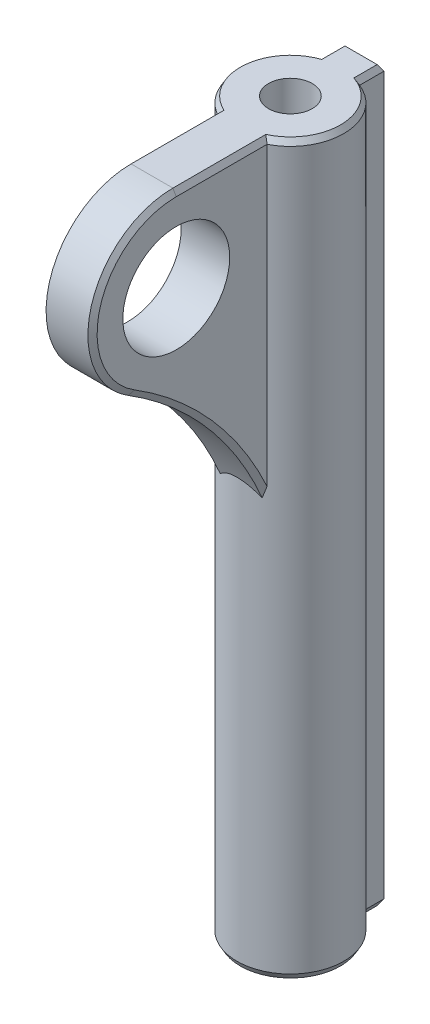
ISO-10303-21;
HEADER;
FILE_DESCRIPTION(('STEP AP214'),'2;1');
FILE_NAME('part.step','',(''),(''),'','','');
FILE_SCHEMA(('AUTOMOTIVE_DESIGN { 1 0 10303 214 1 1 1 1 }'));
ENDSEC;
DATA;
#1=APPLICATION_CONTEXT('core data for automotive mechanical design processes');
#2=APPLICATION_PROTOCOL_DEFINITION('international standard','automotive_design',2000,#1);
#3=PRODUCT_CONTEXT('',#1,'mechanical');
#4=PRODUCT('Part','Part','',(#3));
#5=PRODUCT_RELATED_PRODUCT_CATEGORY('part','',(#4));
#6=PRODUCT_DEFINITION_FORMATION('','',#4);
#7=PRODUCT_DEFINITION_CONTEXT('part definition',#1,'design');
#8=PRODUCT_DEFINITION('design','',#6,#7);
#9=PRODUCT_DEFINITION_SHAPE('','',#8);
#10=(LENGTH_UNIT() NAMED_UNIT(*) SI_UNIT(.MILLI.,.METRE.));
#11=(NAMED_UNIT(*) PLANE_ANGLE_UNIT() SI_UNIT($,.RADIAN.));
#12=(NAMED_UNIT(*) SI_UNIT($,.STERADIAN.) SOLID_ANGLE_UNIT());
#13=UNCERTAINTY_MEASURE_WITH_UNIT(LENGTH_MEASURE(1.E-05),#10,'distance_accuracy_value','');
#14=(GEOMETRIC_REPRESENTATION_CONTEXT(3) GLOBAL_UNCERTAINTY_ASSIGNED_CONTEXT((#13)) GLOBAL_UNIT_ASSIGNED_CONTEXT((#10,
#11,#12)) REPRESENTATION_CONTEXT('',''));
#15=CARTESIAN_POINT('',(0.,0.,0.));
#16=DIRECTION('',(0.,0.,1.));
#17=DIRECTION('',(1.,0.,0.));
#18=AXIS2_PLACEMENT_3D('',#15,#16,#17);
#19=CARTESIAN_POINT('',(0.,-75.,0.));
#20=DIRECTION('',(0.,1.,0.));
#21=DIRECTION('',(0.,0.,1.));
#22=AXIS2_PLACEMENT_3D('',#19,#20,#21);
#23=CYLINDRICAL_SURFACE('',#22,4.5);
#24=CARTESIAN_POINT('',(0.,75.,0.));
#25=DIRECTION('',(0.,1.,0.));
#26=DIRECTION('',(0.,0.,1.));
#27=AXIS2_PLACEMENT_3D('',#24,#25,#26);
#28=CIRCLE('',#27,4.5);
#29=CARTESIAN_POINT('',(0.,75.,4.5));
#30=VERTEX_POINT('',#29);
#31=EDGE_CURVE('E565',#30,#30,#28,.T.);
#32=ORIENTED_EDGE('',*,*,#31,.T.);
#33=EDGE_LOOP('',(#32));
#34=FACE_BOUND('',#33,.T.);
#35=CARTESIAN_POINT('',(0.,-64.,0.));
#36=DIRECTION('',(0.,-1.,0.));
#37=DIRECTION('',(0.,0.,-1.));
#38=AXIS2_PLACEMENT_3D('',#35,#36,#37);
#39=CIRCLE('',#38,4.5);
#40=CARTESIAN_POINT('',(0.,-64.,-4.5));
#41=VERTEX_POINT('',#40);
#42=EDGE_CURVE('E501',#41,#41,#39,.F.);
#43=ORIENTED_EDGE('',*,*,#42,.F.);
#44=EDGE_LOOP('',(#43));
#45=FACE_BOUND('',#44,.T.);
#46=ADVANCED_FACE('F53',(#34,#45),#23,.F.);
#47=CARTESIAN_POINT('',(4.00000000000001,75.,0.));
#48=DIRECTION('',(1.,0.,0.));
#49=DIRECTION('',(0.,0.,-1.));
#50=AXIS2_PLACEMENT_3D('',#47,#48,#49);
#51=PLANE('',#50);
#52=DIRECTION('',(0.,-1.,0.));
#53=VECTOR('',#52,1.);
#54=CARTESIAN_POINT('',(4.,75.,-10.2469507659596));
#55=LINE('',#54,#53);
#56=CARTESIAN_POINT('',(4.,73.7999999999999,-10.2469507659596));
#57=VERTEX_POINT('',#56);
#58=CARTESIAN_POINT('',(4.,-73.8,-10.2469507659596));
#59=VERTEX_POINT('',#58);
#60=EDGE_CURVE('E172',#57,#59,#55,.T.);
#61=ORIENTED_EDGE('',*,*,#60,.T.);
#62=DIRECTION('',(0.,0.,-1.));
#63=VECTOR('',#62,1.);
#64=CARTESIAN_POINT('',(4.,-73.8,-15.2469507659596));
#65=LINE('',#64,#63);
#66=CARTESIAN_POINT('',(4.,-73.8,-15.2469507659596));
#67=VERTEX_POINT('',#66);
#68=EDGE_CURVE('E63',#59,#67,#65,.T.);
#69=ORIENTED_EDGE('',*,*,#68,.T.);
#70=DIRECTION('',(0.,-1.,0.));
#71=VECTOR('',#70,1.);
#72=CARTESIAN_POINT('',(4.,75.,-15.2469507659596));
#73=LINE('',#72,#71);
#74=CARTESIAN_POINT('',(4.,73.7999999999999,-15.2469507659596));
#75=VERTEX_POINT('',#74);
#76=EDGE_CURVE('E432',#75,#67,#73,.T.);
#77=ORIENTED_EDGE('',*,*,#76,.F.);
#78=DIRECTION('',(0.,0.,1.));
#79=VECTOR('',#78,1.);
#80=CARTESIAN_POINT('',(4.00000000000001,73.7999999999999,0.));
#81=LINE('',#80,#79);
#82=EDGE_CURVE('E177',#75,#57,#81,.T.);
#83=ORIENTED_EDGE('',*,*,#82,.T.);
#84=EDGE_LOOP('',(#61,#69,#77,#83));
#85=FACE_BOUND('',#84,.T.);
#86=ADVANCED_FACE('F403',(#85),#51,.T.);
#87=CARTESIAN_POINT('',(0.,75.,-15.2469507659596));
#88=DIRECTION('',(0.,0.,1.));
#89=DIRECTION('',(1.,0.,0.));
#90=AXIS2_PLACEMENT_3D('',#87,#88,#89);
#91=PLANE('',#90);
#92=ORIENTED_EDGE('',*,*,#76,.T.);
#93=DIRECTION('',(-1.,0.,0.));
#94=VECTOR('',#93,1.);
#95=CARTESIAN_POINT('',(0.,-73.8,-15.2469507659596));
#96=LINE('',#95,#94);
#97=CARTESIAN_POINT('',(-4.,-73.8,-15.2469507659596));
#98=VERTEX_POINT('',#97);
#99=EDGE_CURVE('E436',#67,#98,#96,.T.);
#100=ORIENTED_EDGE('',*,*,#99,.T.);
#101=DIRECTION('',(0.,-1.,0.));
#102=VECTOR('',#101,1.);
#103=CARTESIAN_POINT('',(-4.,75.,-15.2469507659596));
#104=LINE('',#103,#102);
#105=CARTESIAN_POINT('',(-4.,73.7999999999999,-15.2469507659596));
#106=VERTEX_POINT('',#105);
#107=EDGE_CURVE('E440',#106,#98,#104,.T.);
#108=ORIENTED_EDGE('',*,*,#107,.F.);
#109=DIRECTION('',(1.,0.,0.));
#110=VECTOR('',#109,1.);
#111=CARTESIAN_POINT('',(4.,73.7999999999999,-15.2469507659596));
#112=LINE('',#111,#110);
#113=EDGE_CURVE('E238',#106,#75,#112,.T.);
#114=ORIENTED_EDGE('',*,*,#113,.T.);
#115=EDGE_LOOP('',(#92,#100,#108,#114));
#116=FACE_BOUND('',#115,.T.);
#117=ADVANCED_FACE('F409',(#116),#91,.F.);
#118=CARTESIAN_POINT('',(-4.,75.,0.));
#119=DIRECTION('',(1.,0.,0.));
#120=DIRECTION('',(0.,0.,-1.));
#121=AXIS2_PLACEMENT_3D('',#118,#119,#120);
#122=PLANE('',#121);
#123=ORIENTED_EDGE('',*,*,#107,.T.);
#124=DIRECTION('',(0.,0.,1.));
#125=VECTOR('',#124,1.);
#126=CARTESIAN_POINT('',(-4.,-73.8,0.));
#127=LINE('',#126,#125);
#128=CARTESIAN_POINT('',(-4.,-73.8,-10.2469507659596));
#129=VERTEX_POINT('',#128);
#130=EDGE_CURVE('E459',#98,#129,#127,.T.);
#131=ORIENTED_EDGE('',*,*,#130,.T.);
#132=DIRECTION('',(0.,-1.,0.));
#133=VECTOR('',#132,1.);
#134=CARTESIAN_POINT('',(-4.,75.,-10.2469507659596));
#135=LINE('',#134,#133);
#136=CARTESIAN_POINT('',(-4.,73.7999999999999,-10.2469507659596));
#137=VERTEX_POINT('',#136);
#138=EDGE_CURVE('E567',#137,#129,#135,.T.);
#139=ORIENTED_EDGE('',*,*,#138,.F.);
#140=DIRECTION('',(0.,0.,-1.));
#141=VECTOR('',#140,1.);
#142=CARTESIAN_POINT('',(-4.,73.7999999999999,-15.2469507659596));
#143=LINE('',#142,#141);
#144=EDGE_CURVE('E240',#137,#106,#143,.T.);
#145=ORIENTED_EDGE('',*,*,#144,.T.);
#146=EDGE_LOOP('',(#123,#131,#139,#145));
#147=FACE_BOUND('',#146,.T.);
#148=ADVANCED_FACE('F423',(#147),#122,.F.);
#149=CARTESIAN_POINT('',(0.,-75.,0.));
#150=DIRECTION('',(0.,1.,0.));
#151=DIRECTION('',(0.,0.,1.));
#152=AXIS2_PLACEMENT_3D('',#149,#150,#151);
#153=PLANE('',#152);
#154=CARTESIAN_POINT('',(0.,-75.,0.));
#155=DIRECTION('',(0.,1.,0.));
#156=DIRECTION('',(0.,0.,1.));
#157=AXIS2_PLACEMENT_3D('',#154,#155,#156);
#158=CIRCLE('',#157,10.3071796769724);
#159=CARTESIAN_POINT('',(3.30717967697245,-75.,-9.76219829124641));
#160=VERTEX_POINT('',#159);
#161=CARTESIAN_POINT('',(-3.30717967697245,-75.,-9.76219829124641));
#162=VERTEX_POINT('',#161);
#163=EDGE_CURVE('E457',#160,#162,#158,.F.);
#164=ORIENTED_EDGE('',*,*,#163,.T.);
#165=DIRECTION('',(0.,0.,-1.));
#166=VECTOR('',#165,1.);
#167=CARTESIAN_POINT('',(-3.30717967697245,-75.,0.));
#168=LINE('',#167,#166);
#169=CARTESIAN_POINT('',(-3.30717967697245,-75.,-14.554130442932));
#170=VERTEX_POINT('',#169);
#171=EDGE_CURVE('E449',#162,#170,#168,.T.);
#172=ORIENTED_EDGE('',*,*,#171,.T.);
#173=DIRECTION('',(1.,0.,0.));
#174=VECTOR('',#173,1.);
#175=CARTESIAN_POINT('',(0.,-75.,-14.554130442932));
#176=LINE('',#175,#174);
#177=CARTESIAN_POINT('',(3.30717967697245,-75.,-14.554130442932));
#178=VERTEX_POINT('',#177);
#179=EDGE_CURVE('E452',#170,#178,#176,.T.);
#180=ORIENTED_EDGE('',*,*,#179,.T.);
#181=DIRECTION('',(0.,0.,1.));
#182=VECTOR('',#181,1.);
#183=CARTESIAN_POINT('',(3.30717967697245,-75.,-10.2469507659596));
#184=LINE('',#183,#182);
#185=EDGE_CURVE('E444',#178,#160,#184,.T.);
#186=ORIENTED_EDGE('',*,*,#185,.T.);
#187=EDGE_LOOP('',(#164,#172,#180,#186));
#188=FACE_BOUND('',#187,.T.);
#189=CARTESIAN_POINT('',(0.,-75.,0.));
#190=DIRECTION('',(0.,-1.,0.));
#191=DIRECTION('',(0.,0.,-1.));
#192=AXIS2_PLACEMENT_3D('',#189,#190,#191);
#193=CIRCLE('',#192,5.2);
#194=CARTESIAN_POINT('',(0.,-75.,-5.2));
#195=VERTEX_POINT('',#194);
#196=EDGE_CURVE('E582',#195,#195,#193,.T.);
#197=ORIENTED_EDGE('',*,*,#196,.F.);
#198=EDGE_LOOP('',(#197));
#199=FACE_BOUND('',#198,.T.);
#200=CARTESIAN_POINT('',(0.,-75.,8.));
#201=DIRECTION('',(0.,-1.,0.));
#202=DIRECTION('',(0.,0.,-1.));
#203=AXIS2_PLACEMENT_3D('',#200,#201,#202);
#204=CIRCLE('',#203,1.3);
#205=CARTESIAN_POINT('',(0.,-75.,6.7));
#206=VERTEX_POINT('',#205);
#207=EDGE_CURVE('E592',#206,#206,#204,.T.);
#208=ORIENTED_EDGE('',*,*,#207,.F.);
#209=EDGE_LOOP('',(#208));
#210=FACE_BOUND('',#209,.T.);
#211=CARTESIAN_POINT('',(8.,-75.,0.));
#212=DIRECTION('',(0.,-1.,0.));
#213=DIRECTION('',(0.,0.,-1.));
#214=AXIS2_PLACEMENT_3D('',#211,#212,#213);
#215=CIRCLE('',#214,1.3);
#216=CARTESIAN_POINT('',(8.,-75.,-1.3));
#217=VERTEX_POINT('',#216);
#218=EDGE_CURVE('E598',#217,#217,#215,.T.);
#219=ORIENTED_EDGE('',*,*,#218,.F.);
#220=EDGE_LOOP('',(#219));
#221=FACE_BOUND('',#220,.T.);
#222=CARTESIAN_POINT('',(0.,-75.,-8.));
#223=DIRECTION('',(0.,-1.,0.));
#224=DIRECTION('',(0.,0.,-1.));
#225=AXIS2_PLACEMENT_3D('',#222,#223,#224);
#226=CIRCLE('',#225,1.3);
#227=CARTESIAN_POINT('',(0.,-75.,-9.3));
#228=VERTEX_POINT('',#227);
#229=EDGE_CURVE('E555',#228,#228,#226,.T.);
#230=ORIENTED_EDGE('',*,*,#229,.F.);
#231=EDGE_LOOP('',(#230));
#232=FACE_BOUND('',#231,.T.);
#233=CARTESIAN_POINT('',(-8.,-75.,0.));
#234=DIRECTION('',(0.,-1.,0.));
#235=DIRECTION('',(0.,0.,-1.));
#236=AXIS2_PLACEMENT_3D('',#233,#234,#235);
#237=CIRCLE('',#236,1.3);
#238=CARTESIAN_POINT('',(-8.,-75.,-1.3));
#239=VERTEX_POINT('',#238);
#240=EDGE_CURVE('E556',#239,#239,#237,.T.);
#241=ORIENTED_EDGE('',*,*,#240,.F.);
#242=EDGE_LOOP('',(#241));
#243=FACE_BOUND('',#242,.T.);
#244=ADVANCED_FACE('F419',(#188,#199,#210,#221,#232,#243),#153,.F.);
#245=CARTESIAN_POINT('',(0.,75.,0.));
#246=DIRECTION('',(0.,1.,0.));
#247=DIRECTION('',(0.,0.,1.));
#248=AXIS2_PLACEMENT_3D('',#245,#246,#247);
#249=PLANE('',#248);
#250=DIRECTION('',(-1.,0.,0.));
#251=VECTOR('',#250,1.);
#252=CARTESIAN_POINT('',(5.,75.,28.5));
#253=LINE('',#252,#251);
#254=CARTESIAN_POINT('',(4.30717967697239,75.,28.5));
#255=VERTEX_POINT('',#254);
#256=CARTESIAN_POINT('',(-4.30717967697239,75.,28.5));
#257=VERTEX_POINT('',#256);
#258=EDGE_CURVE('E483',#255,#257,#253,.T.);
#259=ORIENTED_EDGE('',*,*,#258,.F.);
#260=DIRECTION('',(0.,0.,-1.));
#261=VECTOR('',#260,1.);
#262=CARTESIAN_POINT('',(4.30717967697239,75.,0.));
#263=LINE('',#262,#261);
#264=CARTESIAN_POINT('',(4.30717967697239,75.,9.36408864351831));
#265=VERTEX_POINT('',#264);
#266=EDGE_CURVE('E234',#255,#265,#263,.T.);
#267=ORIENTED_EDGE('',*,*,#266,.T.);
#268=CARTESIAN_POINT('',(0.,75.,0.));
#269=DIRECTION('',(0.,1.,0.));
#270=DIRECTION('',(0.,0.,1.));
#271=AXIS2_PLACEMENT_3D('',#268,#269,#270);
#272=CIRCLE('',#271,10.3071796769724);
#273=CARTESIAN_POINT('',(3.30717967697239,75.,-9.76219829124636));
#274=VERTEX_POINT('',#273);
#275=EDGE_CURVE('E194',#265,#274,#272,.T.);
#276=ORIENTED_EDGE('',*,*,#275,.T.);
#277=DIRECTION('',(0.,0.,-1.));
#278=VECTOR('',#277,1.);
#279=CARTESIAN_POINT('',(3.3071796769724,75.,0.));
#280=LINE('',#279,#278);
#281=CARTESIAN_POINT('',(3.30717967697239,75.,-14.554130442932));
#282=VERTEX_POINT('',#281);
#283=EDGE_CURVE('E231',#274,#282,#280,.T.);
#284=ORIENTED_EDGE('',*,*,#283,.T.);
#285=DIRECTION('',(-1.,0.,0.));
#286=VECTOR('',#285,1.);
#287=CARTESIAN_POINT('',(-4.,75.,-14.554130442932));
#288=LINE('',#287,#286);
#289=CARTESIAN_POINT('',(-3.30717967697239,75.,-14.554130442932));
#290=VERTEX_POINT('',#289);
#291=EDGE_CURVE('E229',#282,#290,#288,.T.);
#292=ORIENTED_EDGE('',*,*,#291,.T.);
#293=DIRECTION('',(0.,0.,1.));
#294=VECTOR('',#293,1.);
#295=CARTESIAN_POINT('',(-3.30717967697239,75.,-10.2469507659596));
#296=LINE('',#295,#294);
#297=CARTESIAN_POINT('',(-3.30717967697239,75.,-9.76219829124637));
#298=VERTEX_POINT('',#297);
#299=EDGE_CURVE('E227',#290,#298,#296,.T.);
#300=ORIENTED_EDGE('',*,*,#299,.T.);
#301=CARTESIAN_POINT('',(0.,75.,0.));
#302=DIRECTION('',(0.,1.,0.));
#303=DIRECTION('',(0.,0.,1.));
#304=AXIS2_PLACEMENT_3D('',#301,#302,#303);
#305=CIRCLE('',#304,10.3071796769724);
#306=CARTESIAN_POINT('',(-4.30717967697239,75.,9.36408864351831));
#307=VERTEX_POINT('',#306);
#308=EDGE_CURVE('E223',#298,#307,#305,.T.);
#309=ORIENTED_EDGE('',*,*,#308,.T.);
#310=DIRECTION('',(0.,0.,1.));
#311=VECTOR('',#310,1.);
#312=CARTESIAN_POINT('',(-4.30717967697239,75.,28.5));
#313=LINE('',#312,#311);
#314=EDGE_CURVE('E225',#307,#257,#313,.T.);
#315=ORIENTED_EDGE('',*,*,#314,.T.);
#316=EDGE_LOOP('',(#259,#267,#276,#284,#292,#300,#309,#315));
#317=FACE_BOUND('',#316,.T.);
#318=ORIENTED_EDGE('',*,*,#31,.F.);
#319=EDGE_LOOP('',(#318));
#320=FACE_BOUND('',#319,.T.);
#321=ADVANCED_FACE('F416',(#317,#320),#249,.T.);
#322=CARTESIAN_POINT('',(0.,75.,0.));
#323=DIRECTION('',(0.,-1.,0.));
#324=DIRECTION('',(0.,0.,-1.));
#325=AXIS2_PLACEMENT_3D('',#322,#323,#324);
#326=CYLINDRICAL_SURFACE('',#325,11.);
#327=ORIENTED_EDGE('',*,*,#138,.T.);
#328=CARTESIAN_POINT('',(0.,-73.8,0.));
#329=DIRECTION('',(0.,1.,0.));
#330=DIRECTION('',(0.,0.,1.));
#331=AXIS2_PLACEMENT_3D('',#328,#329,#330);
#332=CIRCLE('',#331,11.);
#333=EDGE_CURVE('E12',#129,#59,#332,.T.);
#334=ORIENTED_EDGE('',*,*,#333,.T.);
#335=ORIENTED_EDGE('',*,*,#60,.F.);
#336=CARTESIAN_POINT('',(0.,73.7999999999999,0.));
#337=DIRECTION('',(0.,1.,0.));
#338=DIRECTION('',(0.,0.,1.));
#339=AXIS2_PLACEMENT_3D('',#336,#337,#338);
#340=CIRCLE('',#339,11.);
#341=CARTESIAN_POINT('',(5.,73.7999999999999,9.79795897113271));
#342=VERTEX_POINT('',#341);
#343=EDGE_CURVE('E168',#57,#342,#340,.F.);
#344=ORIENTED_EDGE('',*,*,#343,.T.);
#345=DIRECTION('',(0.,-1.,0.));
#346=VECTOR('',#345,1.);
#347=CARTESIAN_POINT('',(5.,75.,9.79795897113271));
#348=LINE('',#347,#346);
#349=CARTESIAN_POINT('',(5.,12.783905391273,9.79795897113271));
#350=VERTEX_POINT('',#349);
#351=EDGE_CURVE('E171',#342,#350,#348,.T.);
#352=ORIENTED_EDGE('',*,*,#351,.T.);
#353=CARTESIAN_POINT('',(5.,12.783905391273,9.79795897113271));
#354=CARTESIAN_POINT('',(4.93930593642414,12.5994630863839,9.82892944244213));
#355=CARTESIAN_POINT('',(4.87937376705051,12.4145886180427,9.85880499231397));
#356=CARTESIAN_POINT('',(4.76100722378545,12.0440758438084,9.91650927441497));
#357=CARTESIAN_POINT('',(4.70257260884592,11.8584376664966,9.94433833741437));
#358=CARTESIAN_POINT('',(4.58715575733198,11.4864388596709,9.9981025082537));
#359=CARTESIAN_POINT('',(4.53017351532743,11.300078232861,10.0240376231754));
#360=CARTESIAN_POINT('',(4.41762188284964,10.926660814369,10.0741453192974));
#361=CARTESIAN_POINT('',(4.3620527227456,10.7396039148025,10.0983176142967));
#362=CARTESIAN_POINT('',(4.30717967697239,10.5522425708362,10.1216699822843));
#363=B_SPLINE_CURVE_WITH_KNOTS('',3,(#353,#354,#355,#356,#357,#358,#359,#360,#361,#362),
.UNSPECIFIED.,.F.,.F.,(4,2,2,2,4),(0.,0.589870659791757,1.179645769277,1.76941867338227,
2.3592871173256),.UNSPECIFIED.);
#364=CARTESIAN_POINT('',(4.30717967697239,10.5522425708362,10.1216699822843));
#365=VERTEX_POINT('',#364);
#366=EDGE_CURVE('E242',#350,#365,#363,.T.);
#367=ORIENTED_EDGE('',*,*,#366,.T.);
#368=CARTESIAN_POINT('',(-5.,9.78129578281709,9.79795897113271));
#369=CARTESIAN_POINT('',(-4.88977114653314,9.9175072341646,9.85419403088753));
#370=CARTESIAN_POINT('',(-4.77605809562833,10.0511824284763,9.90989315751003));
#371=CARTESIAN_POINT('',(-4.54108414471604,10.3126570559207,10.0197546239638));
#372=CARTESIAN_POINT('',(-4.41981539631437,10.4404501312473,10.0739152777786));
#373=CARTESIAN_POINT('',(-4.16740442285191,10.6910282585564,10.1809522650668));
#374=CARTESIAN_POINT('',(-4.03613653041496,10.8137023713564,10.233794815367));
#375=CARTESIAN_POINT('',(-3.76518788335405,11.0505176042248,10.336556114344));
#376=CARTESIAN_POINT('',(-3.62550941375496,11.1646610232328,10.386475649954));
#377=CARTESIAN_POINT('',(-3.19112657023371,11.4937845915818,10.5313870555769));
#378=CARTESIAN_POINT('',(-2.88259175138059,11.6939072144183,10.620865185817));
#379=CARTESIAN_POINT('',(-2.39488797813374,11.9521390877513,10.7374237778581));
#380=CARTESIAN_POINT('',(-2.22863345759289,12.0310733268458,10.7732631768991));
#381=CARTESIAN_POINT('',(-1.88831461387756,12.1732899342777,10.8380935267829));
#382=CARTESIAN_POINT('',(-1.71425417022238,12.2365799780799,10.8670878356969));
#383=CARTESIAN_POINT('',(-1.28327386678282,12.3689017437005,10.927879474447));
#384=CARTESIAN_POINT('',(-1.02283416612037,12.4287540952114,10.9555456190938));
#385=CARTESIAN_POINT('',(-0.494413163601502,12.5076805792695,10.9920729425141));
#386=CARTESIAN_POINT('',(-0.226430338737533,12.5267464160349,11.0009302956667));
#387=CARTESIAN_POINT('',(0.309368520549645,12.5223985689452,10.9989133687759));
#388=CARTESIAN_POINT('',(0.577184193289425,12.4989469991516,10.9880214908059));
#389=CARTESIAN_POINT('',(1.1044367377381,12.4115915150439,10.9476150623476));
#390=CARTESIAN_POINT('',(1.36387501496945,12.3476944239537,10.9181036530067));
#391=CARTESIAN_POINT('',(1.9290689124069,12.1647553393415,10.8341429771761));
#392=CARTESIAN_POINT('',(2.23107446426361,12.0361834090556,10.7754192088337));
#393=CARTESIAN_POINT('',(2.80918324174526,11.7351553948889,10.6394309751355));
#394=CARTESIAN_POINT('',(3.08514565944953,11.5624775966003,10.5620729530989));
#395=CARTESIAN_POINT('',(3.50497366687084,11.2591915348956,10.4279765075665));
#396=CARTESIAN_POINT('',(3.65788312183305,11.1389926907144,10.3751995405287));
#397=CARTESIAN_POINT('',(3.95385979432944,10.8883398055519,10.266054534254));
#398=CARTESIAN_POINT('',(4.09692141975187,10.7578800265038,10.2096844891029));
#399=CARTESIAN_POINT('',(4.37166967662744,10.490229419162,10.0950678604626));
#400=CARTESIAN_POINT('',(4.50348356123695,10.3531529141534,10.0368567769095));
#401=CARTESIAN_POINT('',(4.75820916594745,10.072120236774,9.91861987093207));
#402=CARTESIAN_POINT('',(4.88113458997532,9.92817524852876,9.85859705347558));
#403=CARTESIAN_POINT('',(5.,9.78129578281709,9.79795897113271));
#404=B_SPLINE_CURVE_WITH_KNOTS('',3,(#368,#369,#370,#371,#372,#373,#374,#375,#376,#377,#378,
#379,#380,#381,#382,#383,#384,#385,#386,#387,#388,#389,#390,#391,#392,#393,#394,#395,#396,#397,
#398,#399,#400,#401,#402,#403),.UNSPECIFIED.,.F.,.F.,(4,2,2,2,2,2,2,2,2,2,2,2,2,2,2,2,2,4),(0.,
0.552095816601055,1.10477499928596,1.66618102295876,2.22743520345877,3.3567001686732,
3.91842319758454,4.47987008053151,5.28211508661467,6.08452324998375,6.8876467657559,
7.69063482940796,8.68554261586962,9.6855536321618,10.2896626025659,10.8941118349895,
11.4904200027953,12.0857882827057),.UNSPECIFIED.);
#405=CARTESIAN_POINT('',(-4.30717967697242,10.5522425708362,10.1216699822843));
#406=VERTEX_POINT('',#405);
#407=EDGE_CURVE('E188',#406,#365,#404,.T.);
#408=ORIENTED_EDGE('',*,*,#407,.F.);
#409=CARTESIAN_POINT('',(-4.30717967697239,10.5522425708362,10.1216699822843));
#410=CARTESIAN_POINT('',(-4.3620527227456,10.7396039148025,10.0983176142967));
#411=CARTESIAN_POINT('',(-4.41762188284965,10.926660814369,10.0741453192974));
#412=CARTESIAN_POINT('',(-4.53017351532744,11.300078232861,10.0240376231754));
#413=CARTESIAN_POINT('',(-4.58715575733199,11.4864388596709,9.99810250825369));
#414=CARTESIAN_POINT('',(-4.70257260884592,11.8584376664966,9.94433833741437));
#415=CARTESIAN_POINT('',(-4.76100722378545,12.0440758438085,9.91650927441497));
#416=CARTESIAN_POINT('',(-4.8793737670505,12.4145886180427,9.85880499231397));
#417=CARTESIAN_POINT('',(-4.93930593642413,12.5994630863839,9.82892944244214));
#418=CARTESIAN_POINT('',(-5.,12.783905391273,9.79795897113271));
#419=B_SPLINE_CURVE_WITH_KNOTS('',3,(#409,#410,#411,#412,#413,#414,#415,#416,#417,#418),
.UNSPECIFIED.,.F.,.F.,(4,2,2,2,4),(0.,0.589868443943343,1.17964134804862,1.76941645753387,
2.35928711732564),.UNSPECIFIED.);
#420=CARTESIAN_POINT('',(-5.,12.783905391273,9.79795897113271));
#421=VERTEX_POINT('',#420);
#422=EDGE_CURVE('E250',#406,#421,#419,.T.);
#423=ORIENTED_EDGE('',*,*,#422,.T.);
#424=DIRECTION('',(0.,-1.,0.));
#425=VECTOR('',#424,1.);
#426=CARTESIAN_POINT('',(-5.,75.,9.79795897113271));
#427=LINE('',#426,#425);
#428=CARTESIAN_POINT('',(-5.,73.7999999999999,9.79795897113271));
#429=VERTEX_POINT('',#428);
#430=EDGE_CURVE('E495',#429,#421,#427,.T.);
#431=ORIENTED_EDGE('',*,*,#430,.F.);
#432=CARTESIAN_POINT('',(0.,73.7999999999999,0.));
#433=DIRECTION('',(0.,1.,0.));
#434=DIRECTION('',(0.,0.,1.));
#435=AXIS2_PLACEMENT_3D('',#432,#433,#434);
#436=CIRCLE('',#435,11.);
#437=EDGE_CURVE('E178',#429,#137,#436,.F.);
#438=ORIENTED_EDGE('',*,*,#437,.T.);
#439=EDGE_LOOP('',(#327,#334,#335,#344,#352,#367,#408,#423,#431,#438));
#440=FACE_BOUND('',#439,.T.);
#441=ADVANCED_FACE('F170',(#440),#326,.T.);
#442=CARTESIAN_POINT('',(-8.,-39.,0.));
#443=DIRECTION('',(0.,-1.,0.));
#444=DIRECTION('',(0.,0.,-1.));
#445=AXIS2_PLACEMENT_3D('',#442,#443,#444);
#446=CYLINDRICAL_SURFACE('',#445,1.3);
#447=CARTESIAN_POINT('',(-8.,-39.,0.));
#448=DIRECTION('',(0.,-1.,0.));
#449=DIRECTION('',(0.,0.,-1.));
#450=AXIS2_PLACEMENT_3D('',#447,#448,#449);
#451=CIRCLE('',#450,1.3);
#452=CARTESIAN_POINT('',(-8.,-39.,-1.3));
#453=VERTEX_POINT('',#452);
#454=EDGE_CURVE('E554',#453,#453,#451,.T.);
#455=ORIENTED_EDGE('',*,*,#454,.F.);
#456=EDGE_LOOP('',(#455));
#457=FACE_BOUND('',#456,.T.);
#458=ORIENTED_EDGE('',*,*,#240,.T.);
#459=EDGE_LOOP('',(#458));
#460=FACE_BOUND('',#459,.T.);
#461=ADVANCED_FACE('F414',(#457,#460),#446,.F.);
#462=CARTESIAN_POINT('',(-8.,-39.,0.));
#463=DIRECTION('',(0.,-1.,0.));
#464=DIRECTION('',(0.,0.,-1.));
#465=AXIS2_PLACEMENT_3D('',#462,#463,#464);
#466=PLANE('',#465);
#467=ORIENTED_EDGE('',*,*,#454,.T.);
#468=EDGE_LOOP('',(#467));
#469=FACE_BOUND('',#468,.T.);
#470=ADVANCED_FACE('F544',(#469),#466,.T.);
#471=CARTESIAN_POINT('',(0.,-39.,-8.));
#472=DIRECTION('',(0.,-1.,0.));
#473=DIRECTION('',(0.,0.,-1.));
#474=AXIS2_PLACEMENT_3D('',#471,#472,#473);
#475=CYLINDRICAL_SURFACE('',#474,1.3);
#476=CARTESIAN_POINT('',(0.,-39.,-8.));
#477=DIRECTION('',(0.,-1.,0.));
#478=DIRECTION('',(0.,0.,-1.));
#479=AXIS2_PLACEMENT_3D('',#476,#477,#478);
#480=CIRCLE('',#479,1.3);
#481=CARTESIAN_POINT('',(0.,-39.,-9.3));
#482=VERTEX_POINT('',#481);
#483=EDGE_CURVE('E559',#482,#482,#480,.T.);
#484=ORIENTED_EDGE('',*,*,#483,.F.);
#485=EDGE_LOOP('',(#484));
#486=FACE_BOUND('',#485,.T.);
#487=ORIENTED_EDGE('',*,*,#229,.T.);
#488=EDGE_LOOP('',(#487));
#489=FACE_BOUND('',#488,.T.);
#490=ADVANCED_FACE('F541',(#486,#489),#475,.F.);
#491=CARTESIAN_POINT('',(0.,-39.,-8.));
#492=DIRECTION('',(0.,-1.,0.));
#493=DIRECTION('',(0.,0.,-1.));
#494=AXIS2_PLACEMENT_3D('',#491,#492,#493);
#495=PLANE('',#494);
#496=ORIENTED_EDGE('',*,*,#483,.T.);
#497=EDGE_LOOP('',(#496));
#498=FACE_BOUND('',#497,.T.);
#499=ADVANCED_FACE('F537',(#498),#495,.T.);
#500=CARTESIAN_POINT('',(8.,-39.,0.));
#501=DIRECTION('',(0.,-1.,0.));
#502=DIRECTION('',(0.,0.,-1.));
#503=AXIS2_PLACEMENT_3D('',#500,#501,#502);
#504=CYLINDRICAL_SURFACE('',#503,1.3);
#505=CARTESIAN_POINT('',(8.,-39.,0.));
#506=DIRECTION('',(0.,-1.,0.));
#507=DIRECTION('',(0.,0.,-1.));
#508=AXIS2_PLACEMENT_3D('',#505,#506,#507);
#509=CIRCLE('',#508,1.3);
#510=CARTESIAN_POINT('',(8.,-39.,-1.3));
#511=VERTEX_POINT('',#510);
#512=EDGE_CURVE('E595',#511,#511,#509,.T.);
#513=ORIENTED_EDGE('',*,*,#512,.F.);
#514=EDGE_LOOP('',(#513));
#515=FACE_BOUND('',#514,.T.);
#516=ORIENTED_EDGE('',*,*,#218,.T.);
#517=EDGE_LOOP('',(#516));
#518=FACE_BOUND('',#517,.T.);
#519=ADVANCED_FACE('F533',(#515,#518),#504,.F.);
#520=CARTESIAN_POINT('',(8.,-39.,0.));
#521=DIRECTION('',(0.,-1.,0.));
#522=DIRECTION('',(0.,0.,-1.));
#523=AXIS2_PLACEMENT_3D('',#520,#521,#522);
#524=PLANE('',#523);
#525=ORIENTED_EDGE('',*,*,#512,.T.);
#526=EDGE_LOOP('',(#525));
#527=FACE_BOUND('',#526,.T.);
#528=ADVANCED_FACE('F529',(#527),#524,.T.);
#529=CARTESIAN_POINT('',(0.,-39.,8.));
#530=DIRECTION('',(0.,-1.,0.));
#531=DIRECTION('',(0.,0.,-1.));
#532=AXIS2_PLACEMENT_3D('',#529,#530,#531);
#533=CYLINDRICAL_SURFACE('',#532,1.3);
#534=CARTESIAN_POINT('',(0.,-39.,8.));
#535=DIRECTION('',(0.,-1.,0.));
#536=DIRECTION('',(0.,0.,-1.));
#537=AXIS2_PLACEMENT_3D('',#534,#535,#536);
#538=CIRCLE('',#537,1.3);
#539=CARTESIAN_POINT('',(0.,-39.,6.7));
#540=VERTEX_POINT('',#539);
#541=EDGE_CURVE('E568',#540,#540,#538,.T.);
#542=ORIENTED_EDGE('',*,*,#541,.F.);
#543=EDGE_LOOP('',(#542));
#544=FACE_BOUND('',#543,.T.);
#545=ORIENTED_EDGE('',*,*,#207,.T.);
#546=EDGE_LOOP('',(#545));
#547=FACE_BOUND('',#546,.T.);
#548=ADVANCED_FACE('F525',(#544,#547),#533,.F.);
#549=CARTESIAN_POINT('',(0.,-39.,8.));
#550=DIRECTION('',(0.,-1.,0.));
#551=DIRECTION('',(0.,0.,-1.));
#552=AXIS2_PLACEMENT_3D('',#549,#550,#551);
#553=PLANE('',#552);
#554=ORIENTED_EDGE('',*,*,#541,.T.);
#555=EDGE_LOOP('',(#554));
#556=FACE_BOUND('',#555,.T.);
#557=ADVANCED_FACE('F518',(#556),#553,.T.);
#558=CARTESIAN_POINT('',(0.,-64.,0.));
#559=DIRECTION('',(0.,-1.,0.));
#560=DIRECTION('',(0.,0.,-1.));
#561=AXIS2_PLACEMENT_3D('',#558,#559,#560);
#562=PLANE('',#561);
#563=CARTESIAN_POINT('',(0.,-64.,0.));
#564=DIRECTION('',(0.,-1.,0.));
#565=DIRECTION('',(0.,0.,-1.));
#566=AXIS2_PLACEMENT_3D('',#563,#564,#565);
#567=CIRCLE('',#566,5.2);
#568=CARTESIAN_POINT('',(0.,-64.,-5.2));
#569=VERTEX_POINT('',#568);
#570=EDGE_CURVE('E585',#569,#569,#567,.T.);
#571=ORIENTED_EDGE('',*,*,#570,.T.);
#572=EDGE_LOOP('',(#571));
#573=FACE_BOUND('',#572,.T.);
#574=ORIENTED_EDGE('',*,*,#42,.T.);
#575=EDGE_LOOP('',(#574));
#576=FACE_BOUND('',#575,.T.);
#577=ADVANCED_FACE('F515',(#573,#576),#562,.T.);
#578=CARTESIAN_POINT('',(0.,-64.,0.));
#579=DIRECTION('',(0.,-1.,0.));
#580=DIRECTION('',(0.,0.,-1.));
#581=AXIS2_PLACEMENT_3D('',#578,#579,#580);
#582=CYLINDRICAL_SURFACE('',#581,5.2);
#583=ORIENTED_EDGE('',*,*,#570,.F.);
#584=EDGE_LOOP('',(#583));
#585=FACE_BOUND('',#584,.T.);
#586=ORIENTED_EDGE('',*,*,#196,.T.);
#587=EDGE_LOOP('',(#586));
#588=FACE_BOUND('',#587,.T.);
#589=ADVANCED_FACE('F511',(#585,#588),#582,.F.);
#590=CARTESIAN_POINT('',(5.,-16.9328556485642,74.5));
#591=DIRECTION('',(-1.,0.,0.));
#592=DIRECTION('',(0.,0.,1.));
#593=AXIS2_PLACEMENT_3D('',#590,#591,#592);
#594=CYLINDRICAL_SURFACE('',#593,70.);
#595=ORIENTED_EDGE('',*,*,#407,.T.);
#596=CARTESIAN_POINT('',(4.30717967697239,-16.9328556485642,74.5));
#597=DIRECTION('',(1.,0.,0.));
#598=DIRECTION('',(0.,0.,-1.));
#599=AXIS2_PLACEMENT_3D('',#596,#597,#598);
#600=CIRCLE('',#599,70.);
#601=CARTESIAN_POINT('',(4.30717967697239,42.6134288702872,37.7));
#602=VERTEX_POINT('',#601);
#603=EDGE_CURVE('E211',#365,#602,#600,.T.);
#604=ORIENTED_EDGE('',*,*,#603,.T.);
#605=DIRECTION('',(-1.,0.,0.));
#606=VECTOR('',#605,1.);
#607=CARTESIAN_POINT('',(5.,42.6134288702872,37.7));
#608=LINE('',#607,#606);
#609=CARTESIAN_POINT('',(-4.30717967697239,42.6134288702872,37.7));
#610=VERTEX_POINT('',#609);
#611=EDGE_CURVE('E480',#602,#610,#608,.T.);
#612=ORIENTED_EDGE('',*,*,#611,.T.);
#613=CARTESIAN_POINT('',(-4.30717967697239,-16.9328556485642,74.5));
#614=DIRECTION('',(1.,0.,0.));
#615=DIRECTION('',(0.,0.,-1.));
#616=AXIS2_PLACEMENT_3D('',#613,#614,#615);
#617=CIRCLE('',#616,70.);
#618=EDGE_CURVE('E209',#610,#406,#617,.F.);
#619=ORIENTED_EDGE('',*,*,#618,.T.);
#620=EDGE_LOOP('',(#595,#604,#612,#619));
#621=FACE_BOUND('',#620,.T.);
#622=ADVANCED_FACE('F487',(#621),#594,.F.);
#623=CARTESIAN_POINT('',(5.,0.,0.));
#624=DIRECTION('',(1.,0.,0.));
#625=DIRECTION('',(0.,0.,-1.));
#626=AXIS2_PLACEMENT_3D('',#623,#624,#625);
#627=PLANE('',#626);
#628=CARTESIAN_POINT('',(5.,57.5,28.5));
#629=DIRECTION('',(1.,0.,0.));
#630=DIRECTION('',(0.,0.,-1.));
#631=AXIS2_PLACEMENT_3D('',#628,#629,#630);
#632=CIRCLE('',#631,11.);
#633=CARTESIAN_POINT('',(5.,57.5,17.5));
#634=VERTEX_POINT('',#633);
#635=EDGE_CURVE('E468',#634,#634,#632,.T.);
#636=ORIENTED_EDGE('',*,*,#635,.F.);
#637=EDGE_LOOP('',(#636));
#638=FACE_BOUND('',#637,.T.);
#639=CARTESIAN_POINT('',(5.,57.5,28.5));
#640=DIRECTION('',(1.,0.,0.));
#641=DIRECTION('',(0.,0.,-1.));
#642=AXIS2_PLACEMENT_3D('',#639,#640,#641);
#643=CIRCLE('',#642,16.2999999999999);
#644=CARTESIAN_POINT('',(5.,73.7999999999999,28.5));
#645=VERTEX_POINT('',#644);
#646=CARTESIAN_POINT('',(5.,43.6342223191818,37.0691428571428));
#647=VERTEX_POINT('',#646);
#648=EDGE_CURVE('E203',#645,#647,#643,.T.);
#649=ORIENTED_EDGE('',*,*,#648,.T.);
#650=CARTESIAN_POINT('',(5.,-16.9328556485642,74.5));
#651=DIRECTION('',(1.,0.,0.));
#652=DIRECTION('',(0.,0.,-1.));
#653=AXIS2_PLACEMENT_3D('',#650,#651,#652);
#654=CIRCLE('',#653,71.2000000000001);
#655=EDGE_CURVE('E187',#647,#350,#654,.F.);
#656=ORIENTED_EDGE('',*,*,#655,.T.);
#657=ORIENTED_EDGE('',*,*,#351,.F.);
#658=DIRECTION('',(0.,0.,1.));
#659=VECTOR('',#658,1.);
#660=CARTESIAN_POINT('',(5.,73.7999999999999,0.));
#661=LINE('',#660,#659);
#662=EDGE_CURVE('E184',#342,#645,#661,.T.);
#663=ORIENTED_EDGE('',*,*,#662,.T.);
#664=EDGE_LOOP('',(#649,#656,#657,#663));
#665=FACE_BOUND('',#664,.T.);
#666=ADVANCED_FACE('F182',(#638,#665),#627,.T.);
#667=CARTESIAN_POINT('',(-5.,0.,0.));
#668=DIRECTION('',(1.,0.,0.));
#669=DIRECTION('',(0.,0.,-1.));
#670=AXIS2_PLACEMENT_3D('',#667,#668,#669);
#671=PLANE('',#670);
#672=CARTESIAN_POINT('',(-5.,57.5,28.5));
#673=DIRECTION('',(1.,0.,0.));
#674=DIRECTION('',(0.,0.,-1.));
#675=AXIS2_PLACEMENT_3D('',#672,#673,#674);
#676=CIRCLE('',#675,11.);
#677=CARTESIAN_POINT('',(-5.,57.5,17.5));
#678=VERTEX_POINT('',#677);
#679=EDGE_CURVE('E463',#678,#678,#676,.T.);
#680=ORIENTED_EDGE('',*,*,#679,.T.);
#681=EDGE_LOOP('',(#680));
#682=FACE_BOUND('',#681,.T.);
#683=ORIENTED_EDGE('',*,*,#430,.T.);
#684=CARTESIAN_POINT('',(-5.,-16.9328556485642,74.5));
#685=DIRECTION('',(1.,0.,0.));
#686=DIRECTION('',(0.,0.,-1.));
#687=AXIS2_PLACEMENT_3D('',#684,#685,#686);
#688=CIRCLE('',#687,71.2000000000001);
#689=CARTESIAN_POINT('',(-5.,43.6342223191818,37.0691428571428));
#690=VERTEX_POINT('',#689);
#691=EDGE_CURVE('E217',#421,#690,#688,.T.);
#692=ORIENTED_EDGE('',*,*,#691,.T.);
#693=CARTESIAN_POINT('',(-5.,57.5,28.5));
#694=DIRECTION('',(1.,0.,0.));
#695=DIRECTION('',(0.,0.,-1.));
#696=AXIS2_PLACEMENT_3D('',#693,#694,#695);
#697=CIRCLE('',#696,16.2999999999999);
#698=CARTESIAN_POINT('',(-5.,73.7999999999999,28.5));
#699=VERTEX_POINT('',#698);
#700=EDGE_CURVE('E215',#690,#699,#697,.F.);
#701=ORIENTED_EDGE('',*,*,#700,.T.);
#702=DIRECTION('',(0.,0.,-1.));
#703=VECTOR('',#702,1.);
#704=CARTESIAN_POINT('',(-5.,73.7999999999999,9.79795897113271));
#705=LINE('',#704,#703);
#706=EDGE_CURVE('E213',#699,#429,#705,.T.);
#707=ORIENTED_EDGE('',*,*,#706,.T.);
#708=EDGE_LOOP('',(#683,#692,#701,#707));
#709=FACE_BOUND('',#708,.T.);
#710=ADVANCED_FACE('F497',(#682,#709),#671,.F.);
#711=CARTESIAN_POINT('',(5.,57.5,28.5));
#712=DIRECTION('',(-1.,0.,0.));
#713=DIRECTION('',(0.,0.,1.));
#714=AXIS2_PLACEMENT_3D('',#711,#712,#713);
#715=CYLINDRICAL_SURFACE('',#714,17.5);
#716=ORIENTED_EDGE('',*,*,#611,.F.);
#717=CARTESIAN_POINT('',(4.30717967697239,57.5,28.5));
#718=DIRECTION('',(1.,0.,0.));
#719=DIRECTION('',(0.,0.,-1.));
#720=AXIS2_PLACEMENT_3D('',#717,#718,#719);
#721=CIRCLE('',#720,17.5);
#722=EDGE_CURVE('E221',#602,#255,#721,.F.);
#723=ORIENTED_EDGE('',*,*,#722,.T.);
#724=ORIENTED_EDGE('',*,*,#258,.T.);
#725=CARTESIAN_POINT('',(-4.30717967697239,57.5,28.5));
#726=DIRECTION('',(1.,0.,0.));
#727=DIRECTION('',(0.,0.,-1.));
#728=AXIS2_PLACEMENT_3D('',#725,#726,#727);
#729=CIRCLE('',#728,17.5);
#730=EDGE_CURVE('E219',#257,#610,#729,.T.);
#731=ORIENTED_EDGE('',*,*,#730,.T.);
#732=EDGE_LOOP('',(#716,#723,#724,#731));
#733=FACE_BOUND('',#732,.T.);
#734=ADVANCED_FACE('F479',(#733),#715,.T.);
#735=CARTESIAN_POINT('',(5.,57.5,28.5));
#736=DIRECTION('',(-1.,0.,0.));
#737=DIRECTION('',(0.,0.,1.));
#738=AXIS2_PLACEMENT_3D('',#735,#736,#737);
#739=CYLINDRICAL_SURFACE('',#738,11.);
#740=ORIENTED_EDGE('',*,*,#635,.T.);
#741=EDGE_LOOP('',(#740));
#742=FACE_BOUND('',#741,.T.);
#743=ORIENTED_EDGE('',*,*,#679,.F.);
#744=EDGE_LOOP('',(#743));
#745=FACE_BOUND('',#744,.T.);
#746=ADVANCED_FACE('F363',(#742,#745),#739,.F.);
#747=CARTESIAN_POINT('',(-4.30717967697239,-16.9328556485642,74.5));
#748=DIRECTION('',(-1.,0.,0.));
#749=DIRECTION('',(0.,0.,1.));
#750=AXIS2_PLACEMENT_3D('',#747,#748,#749);
#751=CONICAL_SURFACE('',#750,70.,1.0471975511966);
#752=ORIENTED_EDGE('',*,*,#422,.F.);
#753=ORIENTED_EDGE('',*,*,#618,.F.);
#754=DIRECTION('',(0.5,-0.736694215632877,0.455281926560962));
#755=VECTOR('',#754,1.);
#756=CARTESIAN_POINT('',(-5.,43.6342223191818,37.0691428571428));
#757=LINE('',#756,#755);
#758=EDGE_CURVE('E461',#690,#610,#757,.T.);
#759=ORIENTED_EDGE('',*,*,#758,.F.);
#760=ORIENTED_EDGE('',*,*,#691,.F.);
#761=EDGE_LOOP('',(#752,#753,#759,#760));
#762=FACE_BOUND('',#761,.T.);
#763=ADVANCED_FACE('F356',(#762),#751,.F.);
#764=CARTESIAN_POINT('',(-4.30717967697239,57.5,28.5));
#765=DIRECTION('',(1.,0.,0.));
#766=DIRECTION('',(0.,0.,-1.));
#767=AXIS2_PLACEMENT_3D('',#764,#765,#766);
#768=CONICAL_SURFACE('',#767,17.5,1.0471975511966);
#769=ORIENTED_EDGE('',*,*,#758,.T.);
#770=ORIENTED_EDGE('',*,*,#730,.F.);
#771=DIRECTION('',(0.5,0.866025403784439,0.));
#772=VECTOR('',#771,1.);
#773=CARTESIAN_POINT('',(-5.,73.7999999999999,28.5));
#774=LINE('',#773,#772);
#775=EDGE_CURVE('E340',#699,#257,#774,.T.);
#776=ORIENTED_EDGE('',*,*,#775,.F.);
#777=ORIENTED_EDGE('',*,*,#700,.F.);
#778=EDGE_LOOP('',(#769,#770,#776,#777));
#779=FACE_BOUND('',#778,.T.);
#780=ADVANCED_FACE('F350',(#779),#768,.T.);
#781=CARTESIAN_POINT('',(-5.,73.7999999999999,0.));
#782=DIRECTION('',(-0.866025403784439,0.5,0.));
#783=DIRECTION('',(0.,0.,1.));
#784=AXIS2_PLACEMENT_3D('',#781,#782,#783);
#785=PLANE('',#784);
#786=ORIENTED_EDGE('',*,*,#775,.T.);
#787=ORIENTED_EDGE('',*,*,#314,.F.);
#788=CARTESIAN_POINT('',(-5.,73.7999999999999,9.79795897113271));
#789=CARTESIAN_POINT('',(-4.88429656413032,74.0004042295365,9.72713821686121));
#790=CARTESIAN_POINT('',(-4.76870983880304,74.2006063104838,9.65557199159659));
#791=CARTESIAN_POINT('',(-4.53776973096896,74.6006063107579,9.51094855006901));
#792=CARTESIAN_POINT('',(-4.42241634862037,74.8004042298106,9.43789133279551));
#793=CARTESIAN_POINT('',(-4.30717967697239,75.,9.36408864351834));
#794=B_SPLINE_CURVE_WITH_KNOTS('',3,(#788,#789,#790,#791,#792,#793),.UNSPECIFIED.,.F.,.F.,(4,2,
4),(0.,0.725993112898074,1.45198671786655),.UNSPECIFIED.);
#795=EDGE_CURVE('E332',#429,#307,#794,.T.);
#796=ORIENTED_EDGE('',*,*,#795,.F.);
#797=ORIENTED_EDGE('',*,*,#706,.F.);
#798=EDGE_LOOP('',(#786,#787,#796,#797));
#799=FACE_BOUND('',#798,.T.);
#800=ADVANCED_FACE('F343',(#799),#785,.T.);
#801=CARTESIAN_POINT('',(0.,75.,0.));
#802=DIRECTION('',(0.,-1.,0.));
#803=DIRECTION('',(0.,0.,-1.));
#804=AXIS2_PLACEMENT_3D('',#801,#802,#803);
#805=CONICAL_SURFACE('',#804,10.3071796769724,0.523598775598298);
#806=ORIENTED_EDGE('',*,*,#795,.T.);
#807=ORIENTED_EDGE('',*,*,#308,.F.);
#808=CARTESIAN_POINT('',(-3.30717967697239,75.,-9.76219829124637));
#809=CARTESIAN_POINT('',(-3.42234477984907,74.8005281905587,-9.84473408789501));
#810=CARTESIAN_POINT('',(-3.53766238503991,74.600792239361,-9.92639804410005));
#811=CARTESIAN_POINT('',(-3.76860249299855,74.2007922388712,-10.0879822007213));
#812=CARTESIAN_POINT('',(-3.88422499548358,74.0005281900688,-10.167902402754));
#813=CARTESIAN_POINT('',(-4.,73.7999999999999,-10.2469507659596));
#814=B_SPLINE_CURVE_WITH_KNOTS('',3,(#808,#809,#810,#811,#812,#813),.UNSPECIFIED.,.F.,.F.,(4,2,
4),(0.,0.73399892240911,1.4679971643341),.UNSPECIFIED.);
#815=EDGE_CURVE('E325',#137,#298,#814,.F.);
#816=ORIENTED_EDGE('',*,*,#815,.F.);
#817=ORIENTED_EDGE('',*,*,#437,.F.);
#818=EDGE_LOOP('',(#806,#807,#816,#817));
#819=FACE_BOUND('',#818,.T.);
#820=ADVANCED_FACE('F320',(#819),#805,.T.);
#821=CARTESIAN_POINT('',(-3.30717967697239,75.,0.));
#822=DIRECTION('',(-0.866025403784439,0.5,0.));
#823=DIRECTION('',(0.,0.,-1.));
#824=AXIS2_PLACEMENT_3D('',#821,#822,#823);
#825=PLANE('',#824);
#826=ORIENTED_EDGE('',*,*,#815,.T.);
#827=ORIENTED_EDGE('',*,*,#299,.F.);
#828=DIRECTION('',(-0.447213595499958,-0.774596669241484,-0.447213595499958));
#829=VECTOR('',#828,1.);
#830=CARTESIAN_POINT('',(-0.396353588385995,80.0416986774286,-11.6433043543456));
#831=LINE('',#830,#829);
#832=EDGE_CURVE('E333',#106,#290,#831,.F.);
#833=ORIENTED_EDGE('',*,*,#832,.F.);
#834=ORIENTED_EDGE('',*,*,#144,.F.);
#835=EDGE_LOOP('',(#826,#827,#833,#834));
#836=FACE_BOUND('',#835,.T.);
#837=ADVANCED_FACE('F312',(#836),#825,.T.);
#838=CARTESIAN_POINT('',(0.,75.,-14.554130442932));
#839=DIRECTION('',(0.,0.5,-0.866025403784439));
#840=DIRECTION('',(1.,0.,0.));
#841=AXIS2_PLACEMENT_3D('',#838,#839,#840);
#842=PLANE('',#841);
#843=ORIENTED_EDGE('',*,*,#832,.T.);
#844=ORIENTED_EDGE('',*,*,#291,.F.);
#845=DIRECTION('',(-0.447213595499957,0.774596669241484,0.447213595499958));
#846=VECTOR('',#845,1.);
#847=CARTESIAN_POINT('',(2.64574374157791,76.1456406460551,-13.8926945075375));
#848=LINE('',#847,#846);
#849=EDGE_CURVE('E295',#75,#282,#848,.T.);
#850=ORIENTED_EDGE('',*,*,#849,.F.);
#851=ORIENTED_EDGE('',*,*,#113,.F.);
#852=EDGE_LOOP('',(#843,#844,#850,#851));
#853=FACE_BOUND('',#852,.T.);
#854=ADVANCED_FACE('F305',(#853),#842,.T.);
#855=CARTESIAN_POINT('',(4.00000000000001,73.7999999999999,0.));
#856=DIRECTION('',(-0.866025403784439,-0.5,0.));
#857=DIRECTION('',(0.,0.,1.));
#858=AXIS2_PLACEMENT_3D('',#855,#856,#857);
#859=PLANE('',#858);
#860=ORIENTED_EDGE('',*,*,#849,.T.);
#861=ORIENTED_EDGE('',*,*,#283,.F.);
#862=CARTESIAN_POINT('',(3.30717967697239,75.,-9.76219829124636));
#863=CARTESIAN_POINT('',(3.42234477984907,74.8005281905587,-9.84473408789501));
#864=CARTESIAN_POINT('',(3.53766238503991,74.600792239361,-9.92639804410005));
#865=CARTESIAN_POINT('',(3.76860249299855,74.2007922388712,-10.0879822007213));
#866=CARTESIAN_POINT('',(3.88422499548358,74.0005281900689,-10.167902402754));
#867=CARTESIAN_POINT('',(4.,73.7999999999999,-10.2469507659596));
#868=B_SPLINE_CURVE_WITH_KNOTS('',3,(#862,#863,#864,#865,#866,#867),.UNSPECIFIED.,.F.,.F.,(4,2,
4),(0.,0.73399892240911,1.46799716433409),.UNSPECIFIED.);
#869=EDGE_CURVE('E197',#57,#274,#868,.F.);
#870=ORIENTED_EDGE('',*,*,#869,.F.);
#871=ORIENTED_EDGE('',*,*,#82,.F.);
#872=EDGE_LOOP('',(#860,#861,#870,#871));
#873=FACE_BOUND('',#872,.T.);
#874=ADVANCED_FACE('F298',(#873),#859,.F.);
#875=CARTESIAN_POINT('',(0.,75.,0.));
#876=DIRECTION('',(0.,-1.,0.));
#877=DIRECTION('',(0.,0.,-1.));
#878=AXIS2_PLACEMENT_3D('',#875,#876,#877);
#879=CONICAL_SURFACE('',#878,10.3071796769724,0.523598775598298);
#880=ORIENTED_EDGE('',*,*,#869,.T.);
#881=ORIENTED_EDGE('',*,*,#275,.F.);
#882=CARTESIAN_POINT('',(4.30717967697239,75.,9.36408864351832));
#883=CARTESIAN_POINT('',(4.42241634862036,74.8004042298106,9.43789133279549));
#884=CARTESIAN_POINT('',(4.53776973096895,74.6006063107579,9.510948550069));
#885=CARTESIAN_POINT('',(4.76870983880303,74.2006063104838,9.65557199159659));
#886=CARTESIAN_POINT('',(4.88429656413031,74.0004042295365,9.72713821686123));
#887=CARTESIAN_POINT('',(4.99999999999999,73.7999999999999,9.79795897113274));
#888=B_SPLINE_CURVE_WITH_KNOTS('',3,(#882,#883,#884,#885,#886,#887),.UNSPECIFIED.,.F.,.F.,(4,2,
4),(0.,0.725993604968475,1.45198671786655),.UNSPECIFIED.);
#889=EDGE_CURVE('E192',#342,#265,#888,.F.);
#890=ORIENTED_EDGE('',*,*,#889,.F.);
#891=ORIENTED_EDGE('',*,*,#343,.F.);
#892=EDGE_LOOP('',(#880,#881,#890,#891));
#893=FACE_BOUND('',#892,.T.);
#894=ADVANCED_FACE('F193',(#893),#879,.T.);
#895=CARTESIAN_POINT('',(4.30717967697239,75.,0.));
#896=DIRECTION('',(-0.866025403784439,-0.5,0.));
#897=DIRECTION('',(0.,0.,-1.));
#898=AXIS2_PLACEMENT_3D('',#895,#896,#897);
#899=PLANE('',#898);
#900=ORIENTED_EDGE('',*,*,#889,.T.);
#901=ORIENTED_EDGE('',*,*,#266,.F.);
#902=DIRECTION('',(-0.5,0.866025403784439,0.));
#903=VECTOR('',#902,1.);
#904=CARTESIAN_POINT('',(5.,73.7999999999999,28.5));
#905=LINE('',#904,#903);
#906=EDGE_CURVE('E198',#645,#255,#905,.T.);
#907=ORIENTED_EDGE('',*,*,#906,.F.);
#908=ORIENTED_EDGE('',*,*,#662,.F.);
#909=EDGE_LOOP('',(#900,#901,#907,#908));
#910=FACE_BOUND('',#909,.T.);
#911=ADVANCED_FACE('F200',(#910),#899,.F.);
#912=CARTESIAN_POINT('',(5.,57.5,28.5));
#913=DIRECTION('',(-1.,0.,0.));
#914=DIRECTION('',(0.,0.,1.));
#915=AXIS2_PLACEMENT_3D('',#912,#913,#914);
#916=CONICAL_SURFACE('',#915,16.2999999999999,1.0471975511966);
#917=ORIENTED_EDGE('',*,*,#906,.T.);
#918=ORIENTED_EDGE('',*,*,#722,.F.);
#919=DIRECTION('',(-0.5,-0.736694215632877,0.455281926560962));
#920=VECTOR('',#919,1.);
#921=CARTESIAN_POINT('',(5.,43.6342223191818,37.0691428571428));
#922=LINE('',#921,#920);
#923=EDGE_CURVE('E446',#647,#602,#922,.T.);
#924=ORIENTED_EDGE('',*,*,#923,.F.);
#925=ORIENTED_EDGE('',*,*,#648,.F.);
#926=EDGE_LOOP('',(#917,#918,#924,#925));
#927=FACE_BOUND('',#926,.T.);
#928=ADVANCED_FACE('F268',(#927),#916,.T.);
#929=CARTESIAN_POINT('',(5.,-16.9328556485642,74.5));
#930=DIRECTION('',(1.,0.,0.));
#931=DIRECTION('',(0.,0.,-1.));
#932=AXIS2_PLACEMENT_3D('',#929,#930,#931);
#933=CONICAL_SURFACE('',#932,71.2000000000001,1.0471975511966);
#934=ORIENTED_EDGE('',*,*,#923,.T.);
#935=ORIENTED_EDGE('',*,*,#603,.F.);
#936=ORIENTED_EDGE('',*,*,#366,.F.);
#937=ORIENTED_EDGE('',*,*,#655,.F.);
#938=EDGE_LOOP('',(#934,#935,#936,#937));
#939=FACE_BOUND('',#938,.T.);
#940=ADVANCED_FACE('F260',(#939),#933,.F.);
#941=CARTESIAN_POINT('',(3.30717967697246,-75.,0.));
#942=DIRECTION('',(0.86602540378444,-0.499999999999997,0.));
#943=DIRECTION('',(0.,0.,-1.));
#944=AXIS2_PLACEMENT_3D('',#941,#942,#943);
#945=PLANE('',#944);
#946=CARTESIAN_POINT('',(3.30717967697245,-75.,-9.76219829124641));
#947=CARTESIAN_POINT('',(3.42234477984913,-74.8005281905587,-9.84473408789504));
#948=CARTESIAN_POINT('',(3.53766238503996,-74.600792239361,-9.92639804410008));
#949=CARTESIAN_POINT('',(3.76860249299857,-74.2007922388712,-10.0879822007213));
#950=CARTESIAN_POINT('',(3.88422499548359,-74.0005281900689,-10.167902402754));
#951=CARTESIAN_POINT('',(4.,-73.8,-10.2469507659596));
#952=B_SPLINE_CURVE_WITH_KNOTS('',3,(#946,#947,#948,#949,#950,#951),.UNSPECIFIED.,.F.,.F.,(4,2,
4),(0.,0.733998922409056,1.46799716433397),.UNSPECIFIED.);
#953=EDGE_CURVE('E385',#160,#59,#952,.T.);
#954=ORIENTED_EDGE('',*,*,#953,.F.);
#955=ORIENTED_EDGE('',*,*,#185,.F.);
#956=DIRECTION('',(-0.447213595499956,-0.774596669241486,0.447213595499956));
#957=VECTOR('',#956,1.);
#958=CARTESIAN_POINT('',(0.39635358838607,-80.0416986774286,-11.6433043543457));
#959=LINE('',#958,#957);
#960=EDGE_CURVE('E58',#67,#178,#959,.T.);
#961=ORIENTED_EDGE('',*,*,#960,.F.);
#962=ORIENTED_EDGE('',*,*,#68,.F.);
#963=EDGE_LOOP('',(#954,#955,#961,#962));
#964=FACE_BOUND('',#963,.T.);
#965=ADVANCED_FACE('F267',(#964),#945,.T.);
#966=CARTESIAN_POINT('',(0.,-73.8,-15.2469507659596));
#967=DIRECTION('',(0.,0.499999999999997,0.86602540378444));
#968=DIRECTION('',(-1.,0.,0.));
#969=AXIS2_PLACEMENT_3D('',#966,#967,#968);
#970=PLANE('',#969);
#971=ORIENTED_EDGE('',*,*,#960,.T.);
#972=ORIENTED_EDGE('',*,*,#179,.F.);
#973=DIRECTION('',(-0.447213595499956,0.774596669241486,-0.447213595499956));
#974=VECTOR('',#973,1.);
#975=CARTESIAN_POINT('',(-3.20000000000001,-75.1856406460551,-14.4469507659596));
#976=LINE('',#975,#974);
#977=EDGE_CURVE('E383',#98,#170,#976,.F.);
#978=ORIENTED_EDGE('',*,*,#977,.F.);
#979=ORIENTED_EDGE('',*,*,#99,.F.);
#980=EDGE_LOOP('',(#971,#972,#978,#979));
#981=FACE_BOUND('',#980,.T.);
#982=ADVANCED_FACE('F56',(#981),#970,.F.);
#983=CARTESIAN_POINT('',(0.,-73.8,0.));
#984=DIRECTION('',(0.,1.,0.));
#985=DIRECTION('',(0.,0.,1.));
#986=AXIS2_PLACEMENT_3D('',#983,#984,#985);
#987=CONICAL_SURFACE('',#986,11.,0.523598775598296);
#988=ORIENTED_EDGE('',*,*,#953,.T.);
#989=ORIENTED_EDGE('',*,*,#333,.F.);
#990=CARTESIAN_POINT('',(-4.,-73.8,-10.2469507659596));
#991=CARTESIAN_POINT('',(-3.88422499548359,-74.0005281900689,-10.167902402754));
#992=CARTESIAN_POINT('',(-3.76860249299857,-74.2007922388712,-10.0879822007213));
#993=CARTESIAN_POINT('',(-3.53766238503995,-74.600792239361,-9.92639804410008));
#994=CARTESIAN_POINT('',(-3.42234477984912,-74.8005281905587,-9.84473408789506));
#995=CARTESIAN_POINT('',(-3.30717967697245,-75.,-9.76219829124642));
#996=B_SPLINE_CURVE_WITH_KNOTS('',3,(#990,#991,#992,#993,#994,#995),.UNSPECIFIED.,.F.,.F.,(4,2,
4),(0.,0.733998241924935,1.46799716433397),.UNSPECIFIED.);
#997=EDGE_CURVE('E377',#162,#129,#996,.F.);
#998=ORIENTED_EDGE('',*,*,#997,.F.);
#999=ORIENTED_EDGE('',*,*,#163,.F.);
#1000=EDGE_LOOP('',(#988,#989,#998,#999));
#1001=FACE_BOUND('',#1000,.T.);
#1002=ADVANCED_FACE('F373',(#1001),#987,.T.);
#1003=CARTESIAN_POINT('',(-4.,-73.8,0.));
#1004=DIRECTION('',(0.86602540378444,0.499999999999997,0.));
#1005=DIRECTION('',(0.,0.,1.));
#1006=AXIS2_PLACEMENT_3D('',#1003,#1004,#1005);
#1007=PLANE('',#1006);
#1008=ORIENTED_EDGE('',*,*,#977,.T.);
#1009=ORIENTED_EDGE('',*,*,#171,.F.);
#1010=ORIENTED_EDGE('',*,*,#997,.T.);
#1011=ORIENTED_EDGE('',*,*,#130,.F.);
#1012=EDGE_LOOP('',(#1008,#1009,#1010,#1011));
#1013=FACE_BOUND('',#1012,.T.);
#1014=ADVANCED_FACE('F366',(#1013),#1007,.F.);
#1015=CLOSED_SHELL('',(#46,#86,#117,#148,#244,#321,#441,#461,#470,#490,#499,#519,#528,#548,#557,
#577,#589,#622,#666,#710,#734,#746,#763,#780,#800,#820,#837,#854,#874,#894,#911,#928,#940,#965,
#982,#1002,#1014));
#1016=MANIFOLD_SOLID_BREP('B2',#1015);
#1017=ADVANCED_BREP_SHAPE_REPRESENTATION('',(#18,#1016),#14);
#1018=SHAPE_DEFINITION_REPRESENTATION(#9,#1017);
ENDSEC;
END-ISO-10303-21;
